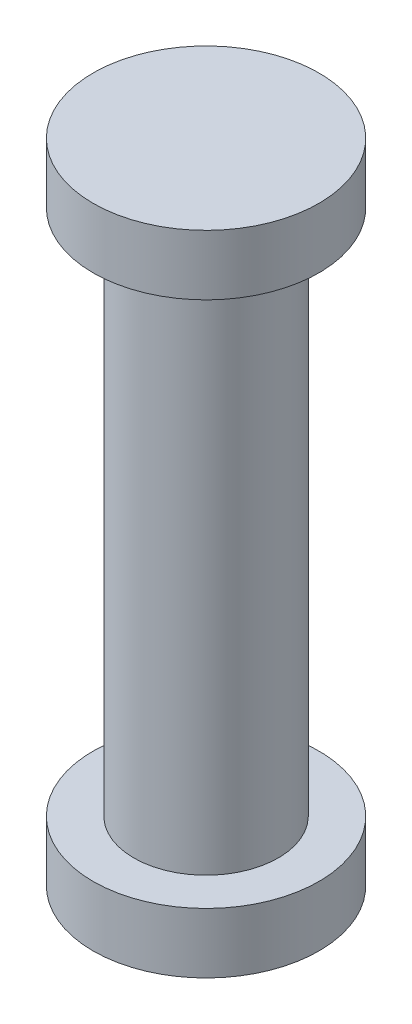
ISO-10303-21;
HEADER;
FILE_DESCRIPTION(('STEP AP214'),'2;1');
FILE_NAME('part.step','',(''),(''),'','','');
FILE_SCHEMA(('AUTOMOTIVE_DESIGN { 1 0 10303 214 1 1 1 1 }'));
ENDSEC;
DATA;
#1=APPLICATION_CONTEXT('core data for automotive mechanical design processes');
#2=APPLICATION_PROTOCOL_DEFINITION('international standard','automotive_design',2000,#1);
#3=PRODUCT_CONTEXT('',#1,'mechanical');
#4=PRODUCT('Part','Part','',(#3));
#5=PRODUCT_RELATED_PRODUCT_CATEGORY('part','',(#4));
#6=PRODUCT_DEFINITION_FORMATION('','',#4);
#7=PRODUCT_DEFINITION_CONTEXT('part definition',#1,'design');
#8=PRODUCT_DEFINITION('design','',#6,#7);
#9=PRODUCT_DEFINITION_SHAPE('','',#8);
#10=(LENGTH_UNIT() NAMED_UNIT(*) SI_UNIT(.MILLI.,.METRE.));
#11=(NAMED_UNIT(*) PLANE_ANGLE_UNIT() SI_UNIT($,.RADIAN.));
#12=(NAMED_UNIT(*) SI_UNIT($,.STERADIAN.) SOLID_ANGLE_UNIT());
#13=UNCERTAINTY_MEASURE_WITH_UNIT(LENGTH_MEASURE(1.E-05),#10,'distance_accuracy_value','');
#14=(GEOMETRIC_REPRESENTATION_CONTEXT(3) GLOBAL_UNCERTAINTY_ASSIGNED_CONTEXT((#13)) GLOBAL_UNIT_ASSIGNED_CONTEXT((#10,
#11,#12)) REPRESENTATION_CONTEXT('',''));
#15=CARTESIAN_POINT('',(0.,0.,0.));
#16=DIRECTION('',(0.,0.,1.));
#17=DIRECTION('',(1.,0.,0.));
#18=AXIS2_PLACEMENT_3D('',#15,#16,#17);
#19=CARTESIAN_POINT('',(0.,11.1125,0.));
#20=DIRECTION('',(0.,-1.,0.));
#21=DIRECTION('',(0.,0.,-1.));
#22=AXIS2_PLACEMENT_3D('',#19,#20,#21);
#23=CYLINDRICAL_SURFACE('',#22,3.048);
#24=CARTESIAN_POINT('',(0.,11.1125,0.));
#25=DIRECTION('',(0.,1.,0.));
#26=DIRECTION('',(0.,0.,1.));
#27=AXIS2_PLACEMENT_3D('',#24,#25,#26);
#28=CIRCLE('',#27,3.048);
#29=CARTESIAN_POINT('',(0.,11.1125,3.048));
#30=VERTEX_POINT('',#29);
#31=EDGE_CURVE('E10',#30,#30,#28,.T.);
#32=ORIENTED_EDGE('',*,*,#31,.F.);
#33=EDGE_LOOP('',(#32));
#34=FACE_BOUND('',#33,.T.);
#35=CARTESIAN_POINT('',(0.,-11.1125,0.));
#36=DIRECTION('',(0.,1.,0.));
#37=DIRECTION('',(0.,0.,1.));
#38=AXIS2_PLACEMENT_3D('',#35,#36,#37);
#39=CIRCLE('',#38,3.048);
#40=CARTESIAN_POINT('',(0.,-11.1125,3.048));
#41=VERTEX_POINT('',#40);
#42=EDGE_CURVE('E34',#41,#41,#39,.T.);
#43=ORIENTED_EDGE('',*,*,#42,.T.);
#44=EDGE_LOOP('',(#43));
#45=FACE_BOUND('',#44,.T.);
#46=ADVANCED_FACE('F31',(#34,#45),#23,.T.);
#47=CARTESIAN_POINT('',(0.,13.6525,0.));
#48=DIRECTION('',(0.,-1.,0.));
#49=DIRECTION('',(0.,0.,-1.));
#50=AXIS2_PLACEMENT_3D('',#47,#48,#49);
#51=CYLINDRICAL_SURFACE('',#50,4.7625);
#52=CARTESIAN_POINT('',(0.,13.6525,0.));
#53=DIRECTION('',(0.,1.,0.));
#54=DIRECTION('',(0.,0.,1.));
#55=AXIS2_PLACEMENT_3D('',#52,#53,#54);
#56=CIRCLE('',#55,4.7625);
#57=CARTESIAN_POINT('',(0.,13.6525,4.7625));
#58=VERTEX_POINT('',#57);
#59=EDGE_CURVE('E38',#58,#58,#56,.T.);
#60=ORIENTED_EDGE('',*,*,#59,.F.);
#61=EDGE_LOOP('',(#60));
#62=FACE_BOUND('',#61,.T.);
#63=CARTESIAN_POINT('',(0.,11.1125,0.));
#64=DIRECTION('',(0.,1.,0.));
#65=DIRECTION('',(0.,0.,1.));
#66=AXIS2_PLACEMENT_3D('',#63,#64,#65);
#67=CIRCLE('',#66,4.7625);
#68=CARTESIAN_POINT('',(0.,11.1125,4.7625));
#69=VERTEX_POINT('',#68);
#70=EDGE_CURVE('E42',#69,#69,#67,.T.);
#71=ORIENTED_EDGE('',*,*,#70,.T.);
#72=EDGE_LOOP('',(#71));
#73=FACE_BOUND('',#72,.T.);
#74=ADVANCED_FACE('F79',(#62,#73),#51,.T.);
#75=CARTESIAN_POINT('',(0.,13.6525,0.));
#76=DIRECTION('',(0.,1.,0.));
#77=DIRECTION('',(0.,0.,1.));
#78=AXIS2_PLACEMENT_3D('',#75,#76,#77);
#79=PLANE('',#78);
#80=ORIENTED_EDGE('',*,*,#59,.T.);
#81=EDGE_LOOP('',(#80));
#82=FACE_BOUND('',#81,.T.);
#83=ADVANCED_FACE('F75',(#82),#79,.T.);
#84=CARTESIAN_POINT('',(0.,11.1125,0.));
#85=DIRECTION('',(0.,1.,0.));
#86=DIRECTION('',(0.,0.,1.));
#87=AXIS2_PLACEMENT_3D('',#84,#85,#86);
#88=PLANE('',#87);
#89=ORIENTED_EDGE('',*,*,#31,.T.);
#90=EDGE_LOOP('',(#89));
#91=FACE_BOUND('',#90,.T.);
#92=ORIENTED_EDGE('',*,*,#70,.F.);
#93=EDGE_LOOP('',(#92));
#94=FACE_BOUND('',#93,.T.);
#95=ADVANCED_FACE('F67',(#91,#94),#88,.F.);
#96=CARTESIAN_POINT('',(0.,-13.6525,0.));
#97=DIRECTION('',(0.,1.,0.));
#98=DIRECTION('',(0.,0.,1.));
#99=AXIS2_PLACEMENT_3D('',#96,#97,#98);
#100=CYLINDRICAL_SURFACE('',#99,4.7625);
#101=CARTESIAN_POINT('',(0.,-13.6525,0.));
#102=DIRECTION('',(0.,1.,0.));
#103=DIRECTION('',(0.,0.,1.));
#104=AXIS2_PLACEMENT_3D('',#101,#102,#103);
#105=CIRCLE('',#104,4.7625);
#106=CARTESIAN_POINT('',(0.,-13.6525,4.7625));
#107=VERTEX_POINT('',#106);
#108=EDGE_CURVE('E50',#107,#107,#105,.T.);
#109=ORIENTED_EDGE('',*,*,#108,.T.);
#110=EDGE_LOOP('',(#109));
#111=FACE_BOUND('',#110,.T.);
#112=CARTESIAN_POINT('',(0.,-11.1125,0.));
#113=DIRECTION('',(0.,1.,0.));
#114=DIRECTION('',(0.,0.,1.));
#115=AXIS2_PLACEMENT_3D('',#112,#113,#114);
#116=CIRCLE('',#115,4.7625);
#117=CARTESIAN_POINT('',(0.,-11.1125,4.7625));
#118=VERTEX_POINT('',#117);
#119=EDGE_CURVE('E47',#118,#118,#116,.T.);
#120=ORIENTED_EDGE('',*,*,#119,.F.);
#121=EDGE_LOOP('',(#120));
#122=FACE_BOUND('',#121,.T.);
#123=ADVANCED_FACE('F65',(#111,#122),#100,.T.);
#124=CARTESIAN_POINT('',(0.,-13.6525,0.));
#125=DIRECTION('',(0.,-1.,0.));
#126=DIRECTION('',(0.,0.,1.));
#127=AXIS2_PLACEMENT_3D('',#124,#125,#126);
#128=PLANE('',#127);
#129=ORIENTED_EDGE('',*,*,#108,.F.);
#130=EDGE_LOOP('',(#129));
#131=FACE_BOUND('',#130,.T.);
#132=ADVANCED_FACE('F61',(#131),#128,.T.);
#133=CARTESIAN_POINT('',(0.,-11.1125,0.));
#134=DIRECTION('',(0.,-1.,0.));
#135=DIRECTION('',(0.,0.,1.));
#136=AXIS2_PLACEMENT_3D('',#133,#134,#135);
#137=PLANE('',#136);
#138=ORIENTED_EDGE('',*,*,#42,.F.);
#139=EDGE_LOOP('',(#138));
#140=FACE_BOUND('',#139,.T.);
#141=ORIENTED_EDGE('',*,*,#119,.T.);
#142=EDGE_LOOP('',(#141));
#143=FACE_BOUND('',#142,.T.);
#144=ADVANCED_FACE('F58',(#140,#143),#137,.F.);
#145=CLOSED_SHELL('',(#46,#74,#83,#95,#123,#132,#144));
#146=MANIFOLD_SOLID_BREP('B2',#145);
#147=ADVANCED_BREP_SHAPE_REPRESENTATION('',(#18,#146),#14);
#148=SHAPE_DEFINITION_REPRESENTATION(#9,#147);
ENDSEC;
END-ISO-10303-21;
